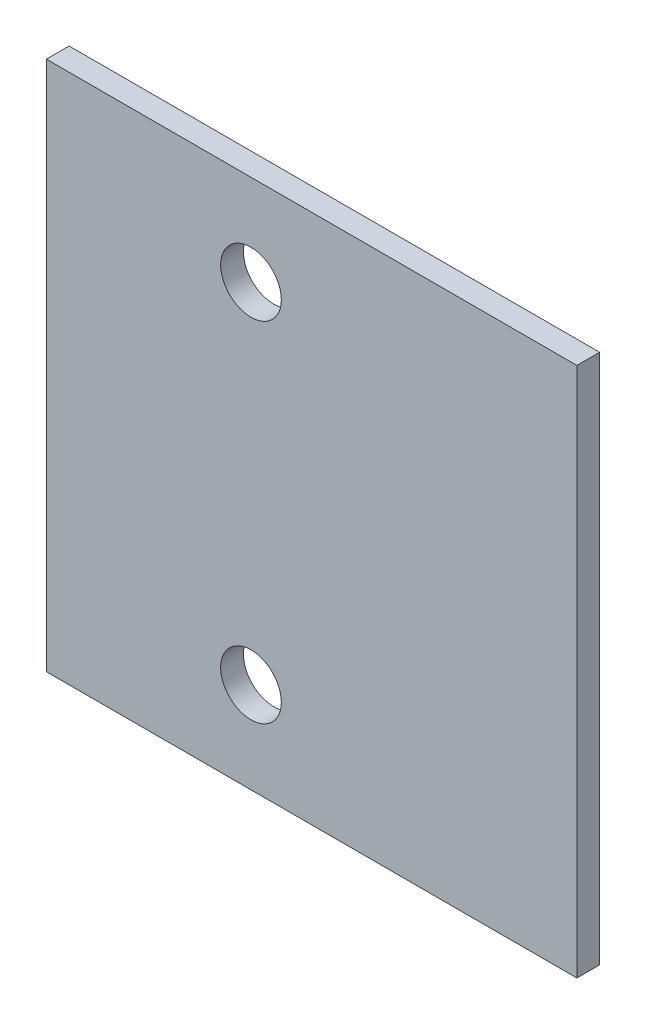
ISO-10303-21;
HEADER;
FILE_DESCRIPTION(('STEP AP214'),'2;1');
FILE_NAME('part.step','',(''),(''),'','','');
FILE_SCHEMA(('AUTOMOTIVE_DESIGN { 1 0 10303 214 1 1 1 1 }'));
ENDSEC;
DATA;
#1=APPLICATION_CONTEXT('core data for automotive mechanical design processes');
#2=APPLICATION_PROTOCOL_DEFINITION('international standard','automotive_design',2000,#1);
#3=PRODUCT_CONTEXT('',#1,'mechanical');
#4=PRODUCT('Part','Part','',(#3));
#5=PRODUCT_RELATED_PRODUCT_CATEGORY('part','',(#4));
#6=PRODUCT_DEFINITION_FORMATION('','',#4);
#7=PRODUCT_DEFINITION_CONTEXT('part definition',#1,'design');
#8=PRODUCT_DEFINITION('design','',#6,#7);
#9=PRODUCT_DEFINITION_SHAPE('','',#8);
#10=(LENGTH_UNIT() NAMED_UNIT(*) SI_UNIT(.MILLI.,.METRE.));
#11=(NAMED_UNIT(*) PLANE_ANGLE_UNIT() SI_UNIT($,.RADIAN.));
#12=(NAMED_UNIT(*) SI_UNIT($,.STERADIAN.) SOLID_ANGLE_UNIT());
#13=UNCERTAINTY_MEASURE_WITH_UNIT(LENGTH_MEASURE(1.E-05),#10,'distance_accuracy_value','');
#14=(GEOMETRIC_REPRESENTATION_CONTEXT(3) GLOBAL_UNCERTAINTY_ASSIGNED_CONTEXT((#13)) GLOBAL_UNIT_ASSIGNED_CONTEXT((#10,
#11,#12)) REPRESENTATION_CONTEXT('',''));
#15=CARTESIAN_POINT('',(0.,0.,0.));
#16=DIRECTION('',(0.,0.,1.));
#17=DIRECTION('',(1.,0.,0.));
#18=AXIS2_PLACEMENT_3D('',#15,#16,#17);
#19=CARTESIAN_POINT('',(0.,0.,1.5));
#20=DIRECTION('',(0.,0.,-1.));
#21=DIRECTION('',(-1.,0.,0.));
#22=AXIS2_PLACEMENT_3D('',#19,#20,#21);
#23=PLANE('',#22);
#24=DIRECTION('',(0.,1.,0.));
#25=VECTOR('',#24,1.);
#26=CARTESIAN_POINT('',(35.,-35.,1.5));
#27=LINE('',#26,#25);
#28=CARTESIAN_POINT('',(35.,-35.,1.5));
#29=VERTEX_POINT('',#28);
#30=CARTESIAN_POINT('',(35.,35.,1.5));
#31=VERTEX_POINT('',#30);
#32=EDGE_CURVE('E88',#29,#31,#27,.T.);
#33=ORIENTED_EDGE('',*,*,#32,.T.);
#34=DIRECTION('',(-1.,0.,0.));
#35=VECTOR('',#34,1.);
#36=CARTESIAN_POINT('',(-35.,35.,1.5));
#37=LINE('',#36,#35);
#38=CARTESIAN_POINT('',(-35.,35.,1.5));
#39=VERTEX_POINT('',#38);
#40=EDGE_CURVE('E83',#31,#39,#37,.T.);
#41=ORIENTED_EDGE('',*,*,#40,.T.);
#42=DIRECTION('',(0.,-1.,0.));
#43=VECTOR('',#42,1.);
#44=CARTESIAN_POINT('',(-35.,-35.,1.5));
#45=LINE('',#44,#43);
#46=CARTESIAN_POINT('',(-35.,-35.,1.5));
#47=VERTEX_POINT('',#46);
#48=EDGE_CURVE('E86',#39,#47,#45,.T.);
#49=ORIENTED_EDGE('',*,*,#48,.T.);
#50=DIRECTION('',(1.,0.,0.));
#51=VECTOR('',#50,1.);
#52=CARTESIAN_POINT('',(-35.,-35.,1.5));
#53=LINE('',#52,#51);
#54=EDGE_CURVE('E53',#47,#29,#53,.T.);
#55=ORIENTED_EDGE('',*,*,#54,.T.);
#56=EDGE_LOOP('',(#33,#41,#49,#55));
#57=FACE_BOUND('',#56,.T.);
#58=CARTESIAN_POINT('',(-8.00000000000001,-23.0000000000001,1.5));
#59=DIRECTION('',(0.,0.,1.));
#60=DIRECTION('',(1.,0.,0.));
#61=AXIS2_PLACEMENT_3D('',#58,#59,#60);
#62=CIRCLE('',#61,4.);
#63=CARTESIAN_POINT('',(-4.,-23.0000000000001,1.5));
#64=VERTEX_POINT('',#63);
#65=EDGE_CURVE('E111',#64,#64,#62,.T.);
#66=ORIENTED_EDGE('',*,*,#65,.F.);
#67=EDGE_LOOP('',(#66));
#68=FACE_BOUND('',#67,.T.);
#69=CARTESIAN_POINT('',(-7.99999999999999,22.9999999999999,1.5));
#70=DIRECTION('',(0.,0.,1.));
#71=DIRECTION('',(1.,0.,0.));
#72=AXIS2_PLACEMENT_3D('',#69,#70,#71);
#73=CIRCLE('',#72,4.);
#74=CARTESIAN_POINT('',(-3.99999999999999,22.9999999999999,1.5));
#75=VERTEX_POINT('',#74);
#76=EDGE_CURVE('E121',#75,#75,#73,.T.);
#77=ORIENTED_EDGE('',*,*,#76,.F.);
#78=EDGE_LOOP('',(#77));
#79=FACE_BOUND('',#78,.T.);
#80=ADVANCED_FACE('F36',(#57,#68,#79),#23,.F.);
#81=CARTESIAN_POINT('',(0.,0.,-1.5));
#82=DIRECTION('',(0.,0.,-1.));
#83=DIRECTION('',(-1.,0.,0.));
#84=AXIS2_PLACEMENT_3D('',#81,#82,#83);
#85=PLANE('',#84);
#86=CARTESIAN_POINT('',(-8.00000000000001,-23.0000000000001,-1.5));
#87=DIRECTION('',(0.,0.,1.));
#88=DIRECTION('',(1.,0.,0.));
#89=AXIS2_PLACEMENT_3D('',#86,#87,#88);
#90=CIRCLE('',#89,4.);
#91=CARTESIAN_POINT('',(-4.,-23.0000000000001,-1.5));
#92=VERTEX_POINT('',#91);
#93=EDGE_CURVE('E118',#92,#92,#90,.T.);
#94=ORIENTED_EDGE('',*,*,#93,.T.);
#95=EDGE_LOOP('',(#94));
#96=FACE_BOUND('',#95,.T.);
#97=DIRECTION('',(0.,1.,0.));
#98=VECTOR('',#97,1.);
#99=CARTESIAN_POINT('',(35.,-35.,-1.5));
#100=LINE('',#99,#98);
#101=CARTESIAN_POINT('',(35.,-35.,-1.5));
#102=VERTEX_POINT('',#101);
#103=CARTESIAN_POINT('',(35.,35.,-1.5));
#104=VERTEX_POINT('',#103);
#105=EDGE_CURVE('E117',#102,#104,#100,.T.);
#106=ORIENTED_EDGE('',*,*,#105,.F.);
#107=DIRECTION('',(1.,0.,0.));
#108=VECTOR('',#107,1.);
#109=CARTESIAN_POINT('',(-35.,-35.,-1.5));
#110=LINE('',#109,#108);
#111=CARTESIAN_POINT('',(-35.,-35.,-1.5));
#112=VERTEX_POINT('',#111);
#113=EDGE_CURVE('E76',#112,#102,#110,.T.);
#114=ORIENTED_EDGE('',*,*,#113,.F.);
#115=DIRECTION('',(0.,-1.,0.));
#116=VECTOR('',#115,1.);
#117=CARTESIAN_POINT('',(-35.,-35.,-1.5));
#118=LINE('',#117,#116);
#119=CARTESIAN_POINT('',(-35.,35.,-1.5));
#120=VERTEX_POINT('',#119);
#121=EDGE_CURVE('E70',#120,#112,#118,.T.);
#122=ORIENTED_EDGE('',*,*,#121,.F.);
#123=DIRECTION('',(-1.,0.,0.));
#124=VECTOR('',#123,1.);
#125=CARTESIAN_POINT('',(-35.,35.,-1.5));
#126=LINE('',#125,#124);
#127=EDGE_CURVE('E93',#104,#120,#126,.T.);
#128=ORIENTED_EDGE('',*,*,#127,.F.);
#129=EDGE_LOOP('',(#106,#114,#122,#128));
#130=FACE_BOUND('',#129,.T.);
#131=CARTESIAN_POINT('',(-7.99999999999999,22.9999999999999,-1.5));
#132=DIRECTION('',(0.,0.,1.));
#133=DIRECTION('',(1.,0.,0.));
#134=AXIS2_PLACEMENT_3D('',#131,#132,#133);
#135=CIRCLE('',#134,4.);
#136=CARTESIAN_POINT('',(-3.99999999999999,22.9999999999999,-1.5));
#137=VERTEX_POINT('',#136);
#138=EDGE_CURVE('E119',#137,#137,#135,.T.);
#139=ORIENTED_EDGE('',*,*,#138,.T.);
#140=EDGE_LOOP('',(#139));
#141=FACE_BOUND('',#140,.T.);
#142=ADVANCED_FACE('F132',(#96,#130,#141),#85,.T.);
#143=CARTESIAN_POINT('',(35.,-35.,1.5));
#144=DIRECTION('',(-1.,0.,0.));
#145=DIRECTION('',(0.,0.,1.));
#146=AXIS2_PLACEMENT_3D('',#143,#144,#145);
#147=PLANE('',#146);
#148=ORIENTED_EDGE('',*,*,#105,.T.);
#149=DIRECTION('',(0.,0.,-1.));
#150=VECTOR('',#149,1.);
#151=CARTESIAN_POINT('',(35.,35.,1.5));
#152=LINE('',#151,#150);
#153=EDGE_CURVE('E12',#31,#104,#152,.T.);
#154=ORIENTED_EDGE('',*,*,#153,.F.);
#155=ORIENTED_EDGE('',*,*,#32,.F.);
#156=DIRECTION('',(0.,0.,-1.));
#157=VECTOR('',#156,1.);
#158=CARTESIAN_POINT('',(35.,-35.,1.5));
#159=LINE('',#158,#157);
#160=EDGE_CURVE('E99',#29,#102,#159,.T.);
#161=ORIENTED_EDGE('',*,*,#160,.T.);
#162=EDGE_LOOP('',(#148,#154,#155,#161));
#163=FACE_BOUND('',#162,.T.);
#164=ADVANCED_FACE('F38',(#163),#147,.F.);
#165=CARTESIAN_POINT('',(-35.,35.,1.5));
#166=DIRECTION('',(0.,-1.,0.));
#167=DIRECTION('',(0.,0.,-1.));
#168=AXIS2_PLACEMENT_3D('',#165,#166,#167);
#169=PLANE('',#168);
#170=ORIENTED_EDGE('',*,*,#127,.T.);
#171=DIRECTION('',(0.,0.,-1.));
#172=VECTOR('',#171,1.);
#173=CARTESIAN_POINT('',(-35.,35.,1.5));
#174=LINE('',#173,#172);
#175=EDGE_CURVE('E45',#39,#120,#174,.T.);
#176=ORIENTED_EDGE('',*,*,#175,.F.);
#177=ORIENTED_EDGE('',*,*,#40,.F.);
#178=ORIENTED_EDGE('',*,*,#153,.T.);
#179=EDGE_LOOP('',(#170,#176,#177,#178));
#180=FACE_BOUND('',#179,.T.);
#181=ADVANCED_FACE('F92',(#180),#169,.F.);
#182=CARTESIAN_POINT('',(-35.,-35.,1.5));
#183=DIRECTION('',(1.,0.,0.));
#184=DIRECTION('',(0.,0.,-1.));
#185=AXIS2_PLACEMENT_3D('',#182,#183,#184);
#186=PLANE('',#185);
#187=ORIENTED_EDGE('',*,*,#121,.T.);
#188=DIRECTION('',(0.,0.,-1.));
#189=VECTOR('',#188,1.);
#190=CARTESIAN_POINT('',(-35.,-35.,1.5));
#191=LINE('',#190,#189);
#192=EDGE_CURVE('E94',#47,#112,#191,.T.);
#193=ORIENTED_EDGE('',*,*,#192,.F.);
#194=ORIENTED_EDGE('',*,*,#48,.F.);
#195=ORIENTED_EDGE('',*,*,#175,.T.);
#196=EDGE_LOOP('',(#187,#193,#194,#195));
#197=FACE_BOUND('',#196,.T.);
#198=ADVANCED_FACE('F95',(#197),#186,.F.);
#199=CARTESIAN_POINT('',(-35.,-35.,1.5));
#200=DIRECTION('',(0.,1.,0.));
#201=DIRECTION('',(0.,0.,1.));
#202=AXIS2_PLACEMENT_3D('',#199,#200,#201);
#203=PLANE('',#202);
#204=ORIENTED_EDGE('',*,*,#113,.T.);
#205=ORIENTED_EDGE('',*,*,#160,.F.);
#206=ORIENTED_EDGE('',*,*,#54,.F.);
#207=ORIENTED_EDGE('',*,*,#192,.T.);
#208=EDGE_LOOP('',(#204,#205,#206,#207));
#209=FACE_BOUND('',#208,.T.);
#210=ADVANCED_FACE('F129',(#209),#203,.F.);
#211=CARTESIAN_POINT('',(-8.00000000000001,-23.0000000000001,1.5));
#212=DIRECTION('',(0.,0.,-1.));
#213=DIRECTION('',(-1.,0.,0.));
#214=AXIS2_PLACEMENT_3D('',#211,#212,#213);
#215=CYLINDRICAL_SURFACE('',#214,4.);
#216=ORIENTED_EDGE('',*,*,#65,.T.);
#217=EDGE_LOOP('',(#216));
#218=FACE_BOUND('',#217,.T.);
#219=ORIENTED_EDGE('',*,*,#93,.F.);
#220=EDGE_LOOP('',(#219));
#221=FACE_BOUND('',#220,.T.);
#222=ADVANCED_FACE('F148',(#218,#221),#215,.F.);
#223=CARTESIAN_POINT('',(-7.99999999999999,22.9999999999999,1.5));
#224=DIRECTION('',(0.,0.,-1.));
#225=DIRECTION('',(-1.,0.,0.));
#226=AXIS2_PLACEMENT_3D('',#223,#224,#225);
#227=CYLINDRICAL_SURFACE('',#226,4.);
#228=ORIENTED_EDGE('',*,*,#76,.T.);
#229=EDGE_LOOP('',(#228));
#230=FACE_BOUND('',#229,.T.);
#231=ORIENTED_EDGE('',*,*,#138,.F.);
#232=EDGE_LOOP('',(#231));
#233=FACE_BOUND('',#232,.T.);
#234=ADVANCED_FACE('F168',(#230,#233),#227,.F.);
#235=CLOSED_SHELL('',(#80,#142,#164,#181,#198,#210,#222,#234));
#236=MANIFOLD_SOLID_BREP('B2',#235);
#237=ADVANCED_BREP_SHAPE_REPRESENTATION('',(#18,#236),#14);
#238=SHAPE_DEFINITION_REPRESENTATION(#9,#237);
ENDSEC;
END-ISO-10303-21;
